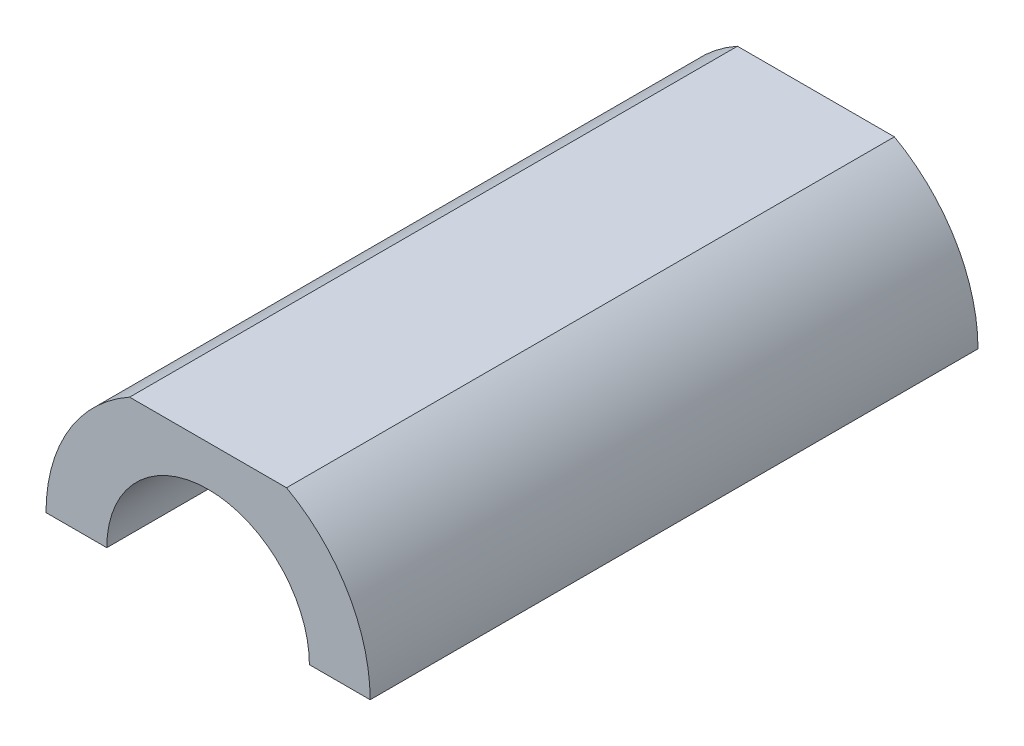
ISO-10303-21;
HEADER;
FILE_DESCRIPTION(('STEP AP214'),'2;1');
FILE_NAME('part.step','',(''),(''),'','','');
FILE_SCHEMA(('AUTOMOTIVE_DESIGN { 1 0 10303 214 1 1 1 1 }'));
ENDSEC;
DATA;
#1=APPLICATION_CONTEXT('core data for automotive mechanical design processes');
#2=APPLICATION_PROTOCOL_DEFINITION('international standard','automotive_design',2000,#1);
#3=PRODUCT_CONTEXT('',#1,'mechanical');
#4=PRODUCT('Part','Part','',(#3));
#5=PRODUCT_RELATED_PRODUCT_CATEGORY('part','',(#4));
#6=PRODUCT_DEFINITION_FORMATION('','',#4);
#7=PRODUCT_DEFINITION_CONTEXT('part definition',#1,'design');
#8=PRODUCT_DEFINITION('design','',#6,#7);
#9=PRODUCT_DEFINITION_SHAPE('','',#8);
#10=(LENGTH_UNIT() NAMED_UNIT(*) SI_UNIT(.MILLI.,.METRE.));
#11=(NAMED_UNIT(*) PLANE_ANGLE_UNIT() SI_UNIT($,.RADIAN.));
#12=(NAMED_UNIT(*) SI_UNIT($,.STERADIAN.) SOLID_ANGLE_UNIT());
#13=UNCERTAINTY_MEASURE_WITH_UNIT(LENGTH_MEASURE(1.E-05),#10,'distance_accuracy_value','');
#14=(GEOMETRIC_REPRESENTATION_CONTEXT(3) GLOBAL_UNCERTAINTY_ASSIGNED_CONTEXT((#13)) GLOBAL_UNIT_ASSIGNED_CONTEXT((#10,
#11,#12)) REPRESENTATION_CONTEXT('',''));
#15=CARTESIAN_POINT('',(0.,0.,0.));
#16=DIRECTION('',(0.,0.,1.));
#17=DIRECTION('',(1.,0.,0.));
#18=AXIS2_PLACEMENT_3D('',#15,#16,#17);
#19=CARTESIAN_POINT('',(0.,0.,30.));
#20=DIRECTION('',(0.,0.,-1.));
#21=DIRECTION('',(-1.,0.,0.));
#22=AXIS2_PLACEMENT_3D('',#19,#20,#21);
#23=CYLINDRICAL_SURFACE('',#22,5.);
#24=CARTESIAN_POINT('',(0.,0.,0.));
#25=DIRECTION('',(0.,0.,-1.));
#26=DIRECTION('',(1.,0.,0.));
#27=AXIS2_PLACEMENT_3D('',#24,#25,#26);
#28=CIRCLE('',#27,5.);
#29=CARTESIAN_POINT('',(-5.,0.,0.));
#30=VERTEX_POINT('',#29);
#31=CARTESIAN_POINT('',(5.,0.,0.));
#32=VERTEX_POINT('',#31);
#33=EDGE_CURVE('E117',#30,#32,#28,.T.);
#34=ORIENTED_EDGE('',*,*,#33,.T.);
#35=DIRECTION('',(0.,0.,-1.));
#36=VECTOR('',#35,1.);
#37=CARTESIAN_POINT('',(5.,0.,30.));
#38=LINE('',#37,#36);
#39=CARTESIAN_POINT('',(5.,0.,30.));
#40=VERTEX_POINT('',#39);
#41=EDGE_CURVE('E11',#40,#32,#38,.T.);
#42=ORIENTED_EDGE('',*,*,#41,.F.);
#43=CARTESIAN_POINT('',(0.,0.,30.));
#44=DIRECTION('',(0.,0.,-1.));
#45=DIRECTION('',(1.,0.,0.));
#46=AXIS2_PLACEMENT_3D('',#43,#44,#45);
#47=CIRCLE('',#46,5.);
#48=CARTESIAN_POINT('',(-5.,0.,30.));
#49=VERTEX_POINT('',#48);
#50=EDGE_CURVE('E127',#49,#40,#47,.T.);
#51=ORIENTED_EDGE('',*,*,#50,.F.);
#52=DIRECTION('',(0.,0.,-1.));
#53=VECTOR('',#52,1.);
#54=CARTESIAN_POINT('',(-5.,0.,30.));
#55=LINE('',#54,#53);
#56=EDGE_CURVE('E113',#49,#30,#55,.T.);
#57=ORIENTED_EDGE('',*,*,#56,.T.);
#58=EDGE_LOOP('',(#34,#42,#51,#57));
#59=FACE_BOUND('',#58,.T.);
#60=ADVANCED_FACE('F33',(#59),#23,.F.);
#61=CARTESIAN_POINT('',(5.,0.,30.));
#62=DIRECTION('',(0.,1.,0.));
#63=DIRECTION('',(0.,0.,1.));
#64=AXIS2_PLACEMENT_3D('',#61,#62,#63);
#65=PLANE('',#64);
#66=DIRECTION('',(1.,0.,0.));
#67=VECTOR('',#66,1.);
#68=CARTESIAN_POINT('',(5.,0.,0.));
#69=LINE('',#68,#67);
#70=CARTESIAN_POINT('',(8.,0.,0.));
#71=VERTEX_POINT('',#70);
#72=EDGE_CURVE('E120',#32,#71,#69,.T.);
#73=ORIENTED_EDGE('',*,*,#72,.T.);
#74=DIRECTION('',(0.,0.,-1.));
#75=VECTOR('',#74,1.);
#76=CARTESIAN_POINT('',(8.,0.,30.));
#77=LINE('',#76,#75);
#78=CARTESIAN_POINT('',(8.,0.,30.));
#79=VERTEX_POINT('',#78);
#80=EDGE_CURVE('E41',#79,#71,#77,.T.);
#81=ORIENTED_EDGE('',*,*,#80,.F.);
#82=DIRECTION('',(1.,0.,0.));
#83=VECTOR('',#82,1.);
#84=CARTESIAN_POINT('',(5.,0.,30.));
#85=LINE('',#84,#83);
#86=EDGE_CURVE('E86',#40,#79,#85,.T.);
#87=ORIENTED_EDGE('',*,*,#86,.F.);
#88=ORIENTED_EDGE('',*,*,#41,.T.);
#89=EDGE_LOOP('',(#73,#81,#87,#88));
#90=FACE_BOUND('',#89,.T.);
#91=ADVANCED_FACE('F151',(#90),#65,.F.);
#92=CARTESIAN_POINT('',(0.,0.,30.));
#93=DIRECTION('',(0.,0.,-1.));
#94=DIRECTION('',(-1.,0.,0.));
#95=AXIS2_PLACEMENT_3D('',#92,#93,#94);
#96=CYLINDRICAL_SURFACE('',#95,8.);
#97=CARTESIAN_POINT('',(0.,0.,0.));
#98=DIRECTION('',(0.,0.,1.));
#99=DIRECTION('',(-1.,0.,0.));
#100=AXIS2_PLACEMENT_3D('',#97,#98,#99);
#101=CIRCLE('',#100,8.);
#102=CARTESIAN_POINT('',(3.87298334620742,7.,0.));
#103=VERTEX_POINT('',#102);
#104=EDGE_CURVE('E122',#71,#103,#101,.T.);
#105=ORIENTED_EDGE('',*,*,#104,.T.);
#106=DIRECTION('',(0.,0.,-1.));
#107=VECTOR('',#106,1.);
#108=CARTESIAN_POINT('',(3.87298334620742,7.,30.));
#109=LINE('',#108,#107);
#110=CARTESIAN_POINT('',(3.87298334620742,7.,30.));
#111=VERTEX_POINT('',#110);
#112=EDGE_CURVE('E108',#111,#103,#109,.T.);
#113=ORIENTED_EDGE('',*,*,#112,.F.);
#114=CARTESIAN_POINT('',(0.,0.,30.));
#115=DIRECTION('',(0.,0.,1.));
#116=DIRECTION('',(-1.,0.,0.));
#117=AXIS2_PLACEMENT_3D('',#114,#115,#116);
#118=CIRCLE('',#117,8.);
#119=EDGE_CURVE('E99',#79,#111,#118,.T.);
#120=ORIENTED_EDGE('',*,*,#119,.F.);
#121=ORIENTED_EDGE('',*,*,#80,.T.);
#122=EDGE_LOOP('',(#105,#113,#120,#121));
#123=FACE_BOUND('',#122,.T.);
#124=ADVANCED_FACE('F133',(#123),#96,.T.);
#125=CARTESIAN_POINT('',(3.87298334620742,7.,30.));
#126=DIRECTION('',(0.,-1.,0.));
#127=DIRECTION('',(1.,0.,0.));
#128=AXIS2_PLACEMENT_3D('',#125,#126,#127);
#129=PLANE('',#128);
#130=DIRECTION('',(-1.,0.,0.));
#131=VECTOR('',#130,1.);
#132=CARTESIAN_POINT('',(3.87298334620742,7.,0.));
#133=LINE('',#132,#131);
#134=CARTESIAN_POINT('',(-3.87298334620742,7.,0.));
#135=VERTEX_POINT('',#134);
#136=EDGE_CURVE('E107',#103,#135,#133,.T.);
#137=ORIENTED_EDGE('',*,*,#136,.T.);
#138=DIRECTION('',(0.,0.,-1.));
#139=VECTOR('',#138,1.);
#140=CARTESIAN_POINT('',(-3.87298334620742,7.,30.));
#141=LINE('',#140,#139);
#142=CARTESIAN_POINT('',(-3.87298334620742,7.,30.));
#143=VERTEX_POINT('',#142);
#144=EDGE_CURVE('E104',#143,#135,#141,.T.);
#145=ORIENTED_EDGE('',*,*,#144,.F.);
#146=DIRECTION('',(-1.,0.,0.));
#147=VECTOR('',#146,1.);
#148=CARTESIAN_POINT('',(3.87298334620742,7.,30.));
#149=LINE('',#148,#147);
#150=EDGE_CURVE('E93',#111,#143,#149,.T.);
#151=ORIENTED_EDGE('',*,*,#150,.F.);
#152=ORIENTED_EDGE('',*,*,#112,.T.);
#153=EDGE_LOOP('',(#137,#145,#151,#152));
#154=FACE_BOUND('',#153,.T.);
#155=ADVANCED_FACE('F105',(#154),#129,.F.);
#156=CARTESIAN_POINT('',(0.,0.,30.));
#157=DIRECTION('',(0.,0.,-1.));
#158=DIRECTION('',(-1.,0.,0.));
#159=AXIS2_PLACEMENT_3D('',#156,#157,#158);
#160=CYLINDRICAL_SURFACE('',#159,8.);
#161=CARTESIAN_POINT('',(0.,0.,0.));
#162=DIRECTION('',(0.,0.,1.));
#163=DIRECTION('',(-1.,0.,0.));
#164=AXIS2_PLACEMENT_3D('',#161,#162,#163);
#165=CIRCLE('',#164,8.);
#166=CARTESIAN_POINT('',(-8.,0.,0.));
#167=VERTEX_POINT('',#166);
#168=EDGE_CURVE('E72',#135,#167,#165,.T.);
#169=ORIENTED_EDGE('',*,*,#168,.T.);
#170=DIRECTION('',(0.,0.,-1.));
#171=VECTOR('',#170,1.);
#172=CARTESIAN_POINT('',(-8.,0.,30.));
#173=LINE('',#172,#171);
#174=CARTESIAN_POINT('',(-8.,0.,30.));
#175=VERTEX_POINT('',#174);
#176=EDGE_CURVE('E109',#175,#167,#173,.T.);
#177=ORIENTED_EDGE('',*,*,#176,.F.);
#178=CARTESIAN_POINT('',(0.,0.,30.));
#179=DIRECTION('',(0.,0.,1.));
#180=DIRECTION('',(-1.,0.,0.));
#181=AXIS2_PLACEMENT_3D('',#178,#179,#180);
#182=CIRCLE('',#181,8.);
#183=EDGE_CURVE('E97',#143,#175,#182,.T.);
#184=ORIENTED_EDGE('',*,*,#183,.F.);
#185=ORIENTED_EDGE('',*,*,#144,.T.);
#186=EDGE_LOOP('',(#169,#177,#184,#185));
#187=FACE_BOUND('',#186,.T.);
#188=ADVANCED_FACE('F111',(#187),#160,.T.);
#189=CARTESIAN_POINT('',(-8.,0.,30.));
#190=DIRECTION('',(0.,1.,0.));
#191=DIRECTION('',(0.,0.,1.));
#192=AXIS2_PLACEMENT_3D('',#189,#190,#191);
#193=PLANE('',#192);
#194=DIRECTION('',(1.,0.,0.));
#195=VECTOR('',#194,1.);
#196=CARTESIAN_POINT('',(-8.,0.,0.));
#197=LINE('',#196,#195);
#198=EDGE_CURVE('E78',#167,#30,#197,.T.);
#199=ORIENTED_EDGE('',*,*,#198,.T.);
#200=ORIENTED_EDGE('',*,*,#56,.F.);
#201=DIRECTION('',(1.,0.,0.));
#202=VECTOR('',#201,1.);
#203=CARTESIAN_POINT('',(-8.,0.,30.));
#204=LINE('',#203,#202);
#205=EDGE_CURVE('E49',#175,#49,#204,.T.);
#206=ORIENTED_EDGE('',*,*,#205,.F.);
#207=ORIENTED_EDGE('',*,*,#176,.T.);
#208=EDGE_LOOP('',(#199,#200,#206,#207));
#209=FACE_BOUND('',#208,.T.);
#210=ADVANCED_FACE('F140',(#209),#193,.F.);
#211=CARTESIAN_POINT('',(0.,0.,30.));
#212=DIRECTION('',(0.,0.,1.));
#213=DIRECTION('',(1.,0.,0.));
#214=AXIS2_PLACEMENT_3D('',#211,#212,#213);
#215=PLANE('',#214);
#216=ORIENTED_EDGE('',*,*,#50,.T.);
#217=ORIENTED_EDGE('',*,*,#86,.T.);
#218=ORIENTED_EDGE('',*,*,#119,.T.);
#219=ORIENTED_EDGE('',*,*,#150,.T.);
#220=ORIENTED_EDGE('',*,*,#183,.T.);
#221=ORIENTED_EDGE('',*,*,#205,.T.);
#222=EDGE_LOOP('',(#216,#217,#218,#219,#220,#221));
#223=FACE_BOUND('',#222,.T.);
#224=ADVANCED_FACE('F95',(#223),#215,.T.);
#225=CARTESIAN_POINT('',(0.,0.,0.));
#226=DIRECTION('',(0.,0.,1.));
#227=DIRECTION('',(1.,0.,0.));
#228=AXIS2_PLACEMENT_3D('',#225,#226,#227);
#229=PLANE('',#228);
#230=ORIENTED_EDGE('',*,*,#33,.F.);
#231=ORIENTED_EDGE('',*,*,#198,.F.);
#232=ORIENTED_EDGE('',*,*,#168,.F.);
#233=ORIENTED_EDGE('',*,*,#136,.F.);
#234=ORIENTED_EDGE('',*,*,#104,.F.);
#235=ORIENTED_EDGE('',*,*,#72,.F.);
#236=EDGE_LOOP('',(#230,#231,#232,#233,#234,#235));
#237=FACE_BOUND('',#236,.T.);
#238=ADVANCED_FACE('F136',(#237),#229,.F.);
#239=CLOSED_SHELL('',(#60,#91,#124,#155,#188,#210,#224,#238));
#240=MANIFOLD_SOLID_BREP('B2',#239);
#241=ADVANCED_BREP_SHAPE_REPRESENTATION('',(#18,#240),#14);
#242=SHAPE_DEFINITION_REPRESENTATION(#9,#241);
ENDSEC;
END-ISO-10303-21;
